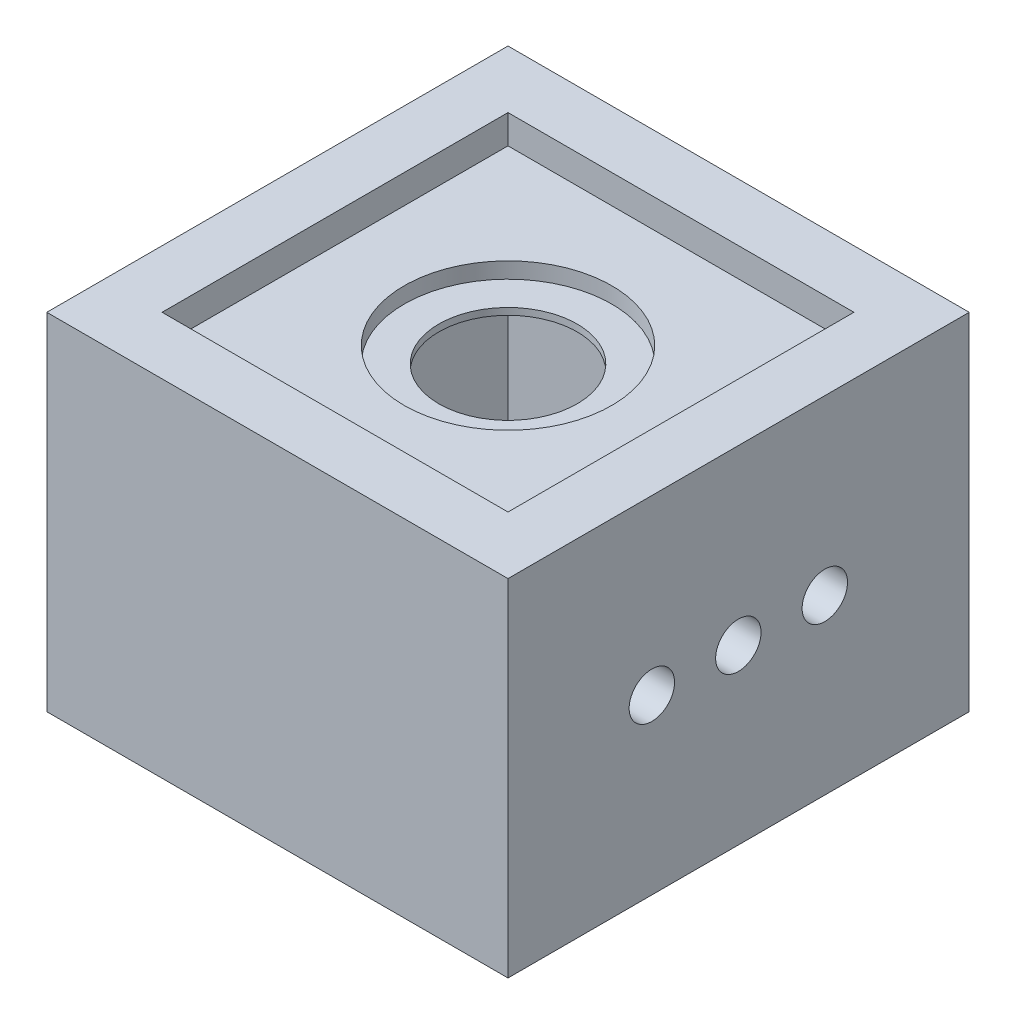
ISO-10303-21;
HEADER;
FILE_DESCRIPTION(('STEP AP214'),'2;1');
FILE_NAME('part.step','',(''),(''),'','','');
FILE_SCHEMA(('AUTOMOTIVE_DESIGN { 1 0 10303 214 1 1 1 1 }'));
ENDSEC;
DATA;
#1=APPLICATION_CONTEXT('core data for automotive mechanical design processes');
#2=APPLICATION_PROTOCOL_DEFINITION('international standard','automotive_design',2000,#1);
#3=PRODUCT_CONTEXT('',#1,'mechanical');
#4=PRODUCT('Part','Part','',(#3));
#5=PRODUCT_RELATED_PRODUCT_CATEGORY('part','',(#4));
#6=PRODUCT_DEFINITION_FORMATION('','',#4);
#7=PRODUCT_DEFINITION_CONTEXT('part definition',#1,'design');
#8=PRODUCT_DEFINITION('design','',#6,#7);
#9=PRODUCT_DEFINITION_SHAPE('','',#8);
#10=(LENGTH_UNIT() NAMED_UNIT(*) SI_UNIT(.MILLI.,.METRE.));
#11=(NAMED_UNIT(*) PLANE_ANGLE_UNIT() SI_UNIT($,.RADIAN.));
#12=(NAMED_UNIT(*) SI_UNIT($,.STERADIAN.) SOLID_ANGLE_UNIT());
#13=UNCERTAINTY_MEASURE_WITH_UNIT(LENGTH_MEASURE(1.E-05),#10,'distance_accuracy_value','');
#14=(GEOMETRIC_REPRESENTATION_CONTEXT(3) GLOBAL_UNCERTAINTY_ASSIGNED_CONTEXT((#13)) GLOBAL_UNIT_ASSIGNED_CONTEXT((#10,
#11,#12)) REPRESENTATION_CONTEXT('',''));
#15=CARTESIAN_POINT('',(0.,0.,0.));
#16=DIRECTION('',(0.,0.,1.));
#17=DIRECTION('',(1.,0.,0.));
#18=AXIS2_PLACEMENT_3D('',#15,#16,#17);
#19=CARTESIAN_POINT('',(0.,64.85,0.));
#20=DIRECTION('',(0.,1.,0.));
#21=DIRECTION('',(0.,0.,1.));
#22=AXIS2_PLACEMENT_3D('',#19,#20,#21);
#23=CYLINDRICAL_SURFACE('',#22,15.24);
#24=CARTESIAN_POINT('',(0.,64.85,0.));
#25=DIRECTION('',(0.,1.,0.));
#26=DIRECTION('',(0.,0.,1.));
#27=AXIS2_PLACEMENT_3D('',#24,#25,#26);
#28=CIRCLE('',#27,15.24);
#29=CARTESIAN_POINT('',(0.,64.85,15.24));
#30=VERTEX_POINT('',#29);
#31=EDGE_CURVE('E153',#30,#30,#28,.T.);
#32=ORIENTED_EDGE('',*,*,#31,.F.);
#33=EDGE_LOOP('',(#32));
#34=FACE_BOUND('',#33,.T.);
#35=CARTESIAN_POINT('',(0.,66.35,0.));
#36=DIRECTION('',(0.,1.,0.));
#37=DIRECTION('',(0.,0.,1.));
#38=AXIS2_PLACEMENT_3D('',#35,#36,#37);
#39=CIRCLE('',#38,15.24);
#40=CARTESIAN_POINT('',(0.,66.35,15.24));
#41=VERTEX_POINT('',#40);
#42=EDGE_CURVE('E37',#41,#41,#39,.F.);
#43=ORIENTED_EDGE('',*,*,#42,.F.);
#44=EDGE_LOOP('',(#43));
#45=FACE_BOUND('',#44,.T.);
#46=ADVANCED_FACE('F33',(#34,#45),#23,.F.);
#47=CARTESIAN_POINT('',(38.1,76.2,38.1));
#48=DIRECTION('',(-1.,0.,0.));
#49=DIRECTION('',(0.,0.,1.));
#50=AXIS2_PLACEMENT_3D('',#47,#48,#49);
#51=PLANE('',#50);
#52=DIRECTION('',(0.,-1.,0.));
#53=VECTOR('',#52,1.);
#54=CARTESIAN_POINT('',(38.1,76.2,-38.1));
#55=LINE('',#54,#53);
#56=CARTESIAN_POINT('',(38.1,76.2,-38.1));
#57=VERTEX_POINT('',#56);
#58=CARTESIAN_POINT('',(38.1,69.85,-38.1));
#59=VERTEX_POINT('',#58);
#60=EDGE_CURVE('E181',#57,#59,#55,.T.);
#61=ORIENTED_EDGE('',*,*,#60,.T.);
#62=DIRECTION('',(0.,0.,-1.));
#63=VECTOR('',#62,1.);
#64=CARTESIAN_POINT('',(38.1,69.85,38.1));
#65=LINE('',#64,#63);
#66=CARTESIAN_POINT('',(38.1,69.85,38.1));
#67=VERTEX_POINT('',#66);
#68=EDGE_CURVE('E150',#67,#59,#65,.T.);
#69=ORIENTED_EDGE('',*,*,#68,.F.);
#70=DIRECTION('',(0.,-1.,0.));
#71=VECTOR('',#70,1.);
#72=CARTESIAN_POINT('',(38.1,76.2,38.1));
#73=LINE('',#72,#71);
#74=CARTESIAN_POINT('',(38.1,76.2,38.1));
#75=VERTEX_POINT('',#74);
#76=EDGE_CURVE('E134',#75,#67,#73,.T.);
#77=ORIENTED_EDGE('',*,*,#76,.F.);
#78=DIRECTION('',(0.,0.,-1.));
#79=VECTOR('',#78,1.);
#80=CARTESIAN_POINT('',(38.1,76.2,38.1));
#81=LINE('',#80,#79);
#82=EDGE_CURVE('E159',#75,#57,#81,.T.);
#83=ORIENTED_EDGE('',*,*,#82,.T.);
#84=EDGE_LOOP('',(#61,#69,#77,#83));
#85=FACE_BOUND('',#84,.T.);
#86=ADVANCED_FACE('F240',(#85),#51,.T.);
#87=CARTESIAN_POINT('',(-38.1,76.2,-38.1));
#88=DIRECTION('',(0.,0.,1.));
#89=DIRECTION('',(1.,0.,0.));
#90=AXIS2_PLACEMENT_3D('',#87,#88,#89);
#91=PLANE('',#90);
#92=DIRECTION('',(0.,-1.,0.));
#93=VECTOR('',#92,1.);
#94=CARTESIAN_POINT('',(-38.1,76.2,-38.1));
#95=LINE('',#94,#93);
#96=CARTESIAN_POINT('',(-38.1,76.2,-38.1));
#97=VERTEX_POINT('',#96);
#98=CARTESIAN_POINT('',(-38.1,69.85,-38.1));
#99=VERTEX_POINT('',#98);
#100=EDGE_CURVE('E177',#97,#99,#95,.T.);
#101=ORIENTED_EDGE('',*,*,#100,.T.);
#102=DIRECTION('',(-1.,0.,0.));
#103=VECTOR('',#102,1.);
#104=CARTESIAN_POINT('',(-38.1,69.85,-38.1));
#105=LINE('',#104,#103);
#106=EDGE_CURVE('E152',#59,#99,#105,.T.);
#107=ORIENTED_EDGE('',*,*,#106,.F.);
#108=ORIENTED_EDGE('',*,*,#60,.F.);
#109=DIRECTION('',(-1.,0.,0.));
#110=VECTOR('',#109,1.);
#111=CARTESIAN_POINT('',(-38.1,76.2,-38.1));
#112=LINE('',#111,#110);
#113=EDGE_CURVE('E161',#57,#97,#112,.T.);
#114=ORIENTED_EDGE('',*,*,#113,.T.);
#115=EDGE_LOOP('',(#101,#107,#108,#114));
#116=FACE_BOUND('',#115,.T.);
#117=ADVANCED_FACE('F246',(#116),#91,.T.);
#118=CARTESIAN_POINT('',(-38.1,76.2,38.1));
#119=DIRECTION('',(1.,0.,0.));
#120=DIRECTION('',(0.,0.,-1.));
#121=AXIS2_PLACEMENT_3D('',#118,#119,#120);
#122=PLANE('',#121);
#123=DIRECTION('',(0.,-1.,0.));
#124=VECTOR('',#123,1.);
#125=CARTESIAN_POINT('',(-38.1,76.2,38.1));
#126=LINE('',#125,#124);
#127=CARTESIAN_POINT('',(-38.1,76.2,38.1));
#128=VERTEX_POINT('',#127);
#129=CARTESIAN_POINT('',(-38.1,69.85,38.1));
#130=VERTEX_POINT('',#129);
#131=EDGE_CURVE('E133',#128,#130,#126,.T.);
#132=ORIENTED_EDGE('',*,*,#131,.T.);
#133=DIRECTION('',(0.,0.,1.));
#134=VECTOR('',#133,1.);
#135=CARTESIAN_POINT('',(-38.1,69.85,38.1));
#136=LINE('',#135,#134);
#137=EDGE_CURVE('E155',#99,#130,#136,.T.);
#138=ORIENTED_EDGE('',*,*,#137,.F.);
#139=ORIENTED_EDGE('',*,*,#100,.F.);
#140=DIRECTION('',(0.,0.,1.));
#141=VECTOR('',#140,1.);
#142=CARTESIAN_POINT('',(-38.1,76.2,38.1));
#143=LINE('',#142,#141);
#144=EDGE_CURVE('E163',#97,#128,#143,.T.);
#145=ORIENTED_EDGE('',*,*,#144,.T.);
#146=EDGE_LOOP('',(#132,#138,#139,#145));
#147=FACE_BOUND('',#146,.T.);
#148=ADVANCED_FACE('F270',(#147),#122,.T.);
#149=CARTESIAN_POINT('',(-38.1,76.2,38.1));
#150=DIRECTION('',(0.,0.,-1.));
#151=DIRECTION('',(-1.,0.,0.));
#152=AXIS2_PLACEMENT_3D('',#149,#150,#151);
#153=PLANE('',#152);
#154=ORIENTED_EDGE('',*,*,#76,.T.);
#155=DIRECTION('',(1.,0.,0.));
#156=VECTOR('',#155,1.);
#157=CARTESIAN_POINT('',(-38.1,69.85,38.1));
#158=LINE('',#157,#156);
#159=EDGE_CURVE('E157',#130,#67,#158,.T.);
#160=ORIENTED_EDGE('',*,*,#159,.F.);
#161=ORIENTED_EDGE('',*,*,#131,.F.);
#162=DIRECTION('',(1.,0.,0.));
#163=VECTOR('',#162,1.);
#164=CARTESIAN_POINT('',(-38.1,76.2,38.1));
#165=LINE('',#164,#163);
#166=EDGE_CURVE('E166',#128,#75,#165,.T.);
#167=ORIENTED_EDGE('',*,*,#166,.T.);
#168=EDGE_LOOP('',(#154,#160,#161,#167));
#169=FACE_BOUND('',#168,.T.);
#170=ADVANCED_FACE('F266',(#169),#153,.T.);
#171=CARTESIAN_POINT('',(0.,76.2,0.));
#172=DIRECTION('',(0.,-1.,0.));
#173=DIRECTION('',(0.,0.,-1.));
#174=AXIS2_PLACEMENT_3D('',#171,#172,#173);
#175=PLANE('',#174);
#176=DIRECTION('',(0.,0.,-1.));
#177=VECTOR('',#176,1.);
#178=CARTESIAN_POINT('',(50.8,76.2,50.8));
#179=LINE('',#178,#177);
#180=CARTESIAN_POINT('',(50.8,76.2,50.8));
#181=VERTEX_POINT('',#180);
#182=CARTESIAN_POINT('',(50.8,76.2,-50.8));
#183=VERTEX_POINT('',#182);
#184=EDGE_CURVE('E185',#181,#183,#179,.T.);
#185=ORIENTED_EDGE('',*,*,#184,.T.);
#186=DIRECTION('',(-1.,0.,0.));
#187=VECTOR('',#186,1.);
#188=CARTESIAN_POINT('',(-50.8,76.2,-50.8));
#189=LINE('',#188,#187);
#190=CARTESIAN_POINT('',(-50.8,76.2,-50.8));
#191=VERTEX_POINT('',#190);
#192=EDGE_CURVE('E188',#183,#191,#189,.T.);
#193=ORIENTED_EDGE('',*,*,#192,.T.);
#194=DIRECTION('',(0.,0.,1.));
#195=VECTOR('',#194,1.);
#196=CARTESIAN_POINT('',(-50.8,76.2,50.8));
#197=LINE('',#196,#195);
#198=CARTESIAN_POINT('',(-50.8,76.2,50.8));
#199=VERTEX_POINT('',#198);
#200=EDGE_CURVE('E191',#191,#199,#197,.T.);
#201=ORIENTED_EDGE('',*,*,#200,.T.);
#202=DIRECTION('',(1.,0.,0.));
#203=VECTOR('',#202,1.);
#204=CARTESIAN_POINT('',(-50.8,76.2,50.8));
#205=LINE('',#204,#203);
#206=EDGE_CURVE('E193',#199,#181,#205,.T.);
#207=ORIENTED_EDGE('',*,*,#206,.T.);
#208=EDGE_LOOP('',(#185,#193,#201,#207));
#209=FACE_BOUND('',#208,.T.);
#210=ORIENTED_EDGE('',*,*,#82,.F.);
#211=ORIENTED_EDGE('',*,*,#166,.F.);
#212=ORIENTED_EDGE('',*,*,#144,.F.);
#213=ORIENTED_EDGE('',*,*,#113,.F.);
#214=EDGE_LOOP('',(#210,#211,#212,#213));
#215=FACE_BOUND('',#214,.T.);
#216=ADVANCED_FACE('F229',(#209,#215),#175,.F.);
#217=CARTESIAN_POINT('',(0.,0.,0.));
#218=DIRECTION('',(0.,-1.,0.));
#219=DIRECTION('',(0.,0.,-1.));
#220=AXIS2_PLACEMENT_3D('',#217,#218,#219);
#221=PLANE('',#220);
#222=DIRECTION('',(0.,0.,-1.));
#223=VECTOR('',#222,1.);
#224=CARTESIAN_POINT('',(50.8,0.,50.8));
#225=LINE('',#224,#223);
#226=CARTESIAN_POINT('',(50.8,0.,50.8));
#227=VERTEX_POINT('',#226);
#228=CARTESIAN_POINT('',(50.8,0.,-50.8));
#229=VERTEX_POINT('',#228);
#230=EDGE_CURVE('E184',#227,#229,#225,.T.);
#231=ORIENTED_EDGE('',*,*,#230,.F.);
#232=DIRECTION('',(1.,0.,0.));
#233=VECTOR('',#232,1.);
#234=CARTESIAN_POINT('',(-50.8,0.,50.8));
#235=LINE('',#234,#233);
#236=CARTESIAN_POINT('',(-50.8,0.,50.8));
#237=VERTEX_POINT('',#236);
#238=EDGE_CURVE('E189',#237,#227,#235,.T.);
#239=ORIENTED_EDGE('',*,*,#238,.F.);
#240=DIRECTION('',(0.,0.,1.));
#241=VECTOR('',#240,1.);
#242=CARTESIAN_POINT('',(-50.8,0.,50.8));
#243=LINE('',#242,#241);
#244=CARTESIAN_POINT('',(-50.8,0.,-50.8));
#245=VERTEX_POINT('',#244);
#246=EDGE_CURVE('E200',#245,#237,#243,.T.);
#247=ORIENTED_EDGE('',*,*,#246,.F.);
#248=DIRECTION('',(-1.,0.,0.));
#249=VECTOR('',#248,1.);
#250=CARTESIAN_POINT('',(-50.8,0.,-50.8));
#251=LINE('',#250,#249);
#252=EDGE_CURVE('E198',#229,#245,#251,.T.);
#253=ORIENTED_EDGE('',*,*,#252,.F.);
#254=EDGE_LOOP('',(#231,#239,#247,#253));
#255=FACE_BOUND('',#254,.T.);
#256=DIRECTION('',(1.,0.,0.));
#257=VECTOR('',#256,1.);
#258=CARTESIAN_POINT('',(-38.1,0.,38.1));
#259=LINE('',#258,#257);
#260=CARTESIAN_POINT('',(-38.1,0.,38.1));
#261=VERTEX_POINT('',#260);
#262=CARTESIAN_POINT('',(38.1,0.,38.1));
#263=VERTEX_POINT('',#262);
#264=EDGE_CURVE('E129',#261,#263,#259,.T.);
#265=ORIENTED_EDGE('',*,*,#264,.T.);
#266=DIRECTION('',(0.,0.,-1.));
#267=VECTOR('',#266,1.);
#268=CARTESIAN_POINT('',(38.1,0.,38.1));
#269=LINE('',#268,#267);
#270=CARTESIAN_POINT('',(38.1,0.,-38.1));
#271=VERTEX_POINT('',#270);
#272=EDGE_CURVE('E143',#263,#271,#269,.T.);
#273=ORIENTED_EDGE('',*,*,#272,.T.);
#274=DIRECTION('',(-1.,0.,0.));
#275=VECTOR('',#274,1.);
#276=CARTESIAN_POINT('',(-38.1,0.,-38.1));
#277=LINE('',#276,#275);
#278=CARTESIAN_POINT('',(-38.1,0.,-38.1));
#279=VERTEX_POINT('',#278);
#280=EDGE_CURVE('E146',#271,#279,#277,.T.);
#281=ORIENTED_EDGE('',*,*,#280,.T.);
#282=DIRECTION('',(0.,0.,1.));
#283=VECTOR('',#282,1.);
#284=CARTESIAN_POINT('',(-38.1,0.,38.1));
#285=LINE('',#284,#283);
#286=EDGE_CURVE('E171',#279,#261,#285,.T.);
#287=ORIENTED_EDGE('',*,*,#286,.T.);
#288=EDGE_LOOP('',(#265,#273,#281,#287));
#289=FACE_BOUND('',#288,.T.);
#290=ADVANCED_FACE('F219',(#255,#289),#221,.T.);
#291=CARTESIAN_POINT('',(50.8,76.2,50.8));
#292=DIRECTION('',(-1.,0.,0.));
#293=DIRECTION('',(0.,0.,1.));
#294=AXIS2_PLACEMENT_3D('',#291,#292,#293);
#295=PLANE('',#294);
#296=CARTESIAN_POINT('',(50.8,38.1,19.1106830094893));
#297=DIRECTION('',(1.,0.,0.));
#298=DIRECTION('',(0.,0.,-1.));
#299=AXIS2_PLACEMENT_3D('',#296,#297,#298);
#300=CIRCLE('',#299,5.);
#301=CARTESIAN_POINT('',(50.8,38.1,14.1106830094893));
#302=VERTEX_POINT('',#301);
#303=EDGE_CURVE('E445',#302,#302,#300,.T.);
#304=ORIENTED_EDGE('',*,*,#303,.F.);
#305=EDGE_LOOP('',(#304));
#306=FACE_BOUND('',#305,.T.);
#307=CARTESIAN_POINT('',(50.8,38.1,0.0606830094893179));
#308=DIRECTION('',(1.,0.,0.));
#309=DIRECTION('',(0.,0.,-1.));
#310=AXIS2_PLACEMENT_3D('',#307,#308,#309);
#311=CIRCLE('',#310,5.);
#312=CARTESIAN_POINT('',(50.8,38.1,-4.93931699051068));
#313=VERTEX_POINT('',#312);
#314=EDGE_CURVE('E457',#313,#313,#311,.T.);
#315=ORIENTED_EDGE('',*,*,#314,.F.);
#316=EDGE_LOOP('',(#315));
#317=FACE_BOUND('',#316,.T.);
#318=CARTESIAN_POINT('',(50.8,38.1,-18.9893169905107));
#319=DIRECTION('',(1.,0.,0.));
#320=DIRECTION('',(0.,0.,-1.));
#321=AXIS2_PLACEMENT_3D('',#318,#319,#320);
#322=CIRCLE('',#321,5.);
#323=CARTESIAN_POINT('',(50.8,38.1,-23.9893169905107));
#324=VERTEX_POINT('',#323);
#325=EDGE_CURVE('E463',#324,#324,#322,.T.);
#326=ORIENTED_EDGE('',*,*,#325,.F.);
#327=EDGE_LOOP('',(#326));
#328=FACE_BOUND('',#327,.T.);
#329=ORIENTED_EDGE('',*,*,#230,.T.);
#330=DIRECTION('',(0.,-1.,0.));
#331=VECTOR('',#330,1.);
#332=CARTESIAN_POINT('',(50.8,76.2,-50.8));
#333=LINE('',#332,#331);
#334=EDGE_CURVE('E11',#183,#229,#333,.T.);
#335=ORIENTED_EDGE('',*,*,#334,.F.);
#336=ORIENTED_EDGE('',*,*,#184,.F.);
#337=DIRECTION('',(0.,-1.,0.));
#338=VECTOR('',#337,1.);
#339=CARTESIAN_POINT('',(50.8,76.2,50.8));
#340=LINE('',#339,#338);
#341=EDGE_CURVE('E195',#181,#227,#340,.T.);
#342=ORIENTED_EDGE('',*,*,#341,.T.);
#343=EDGE_LOOP('',(#329,#335,#336,#342));
#344=FACE_BOUND('',#343,.T.);
#345=ADVANCED_FACE('F35',(#306,#317,#328,#344),#295,.F.);
#346=CARTESIAN_POINT('',(-50.8,76.2,-50.8));
#347=DIRECTION('',(0.,0.,1.));
#348=DIRECTION('',(1.,0.,0.));
#349=AXIS2_PLACEMENT_3D('',#346,#347,#348);
#350=PLANE('',#349);
#351=ORIENTED_EDGE('',*,*,#252,.T.);
#352=DIRECTION('',(0.,-1.,0.));
#353=VECTOR('',#352,1.);
#354=CARTESIAN_POINT('',(-50.8,76.2,-50.8));
#355=LINE('',#354,#353);
#356=EDGE_CURVE('E42',#191,#245,#355,.T.);
#357=ORIENTED_EDGE('',*,*,#356,.F.);
#358=ORIENTED_EDGE('',*,*,#192,.F.);
#359=ORIENTED_EDGE('',*,*,#334,.T.);
#360=EDGE_LOOP('',(#351,#357,#358,#359));
#361=FACE_BOUND('',#360,.T.);
#362=ADVANCED_FACE('F231',(#361),#350,.F.);
#363=CARTESIAN_POINT('',(-50.8,76.2,50.8));
#364=DIRECTION('',(1.,0.,0.));
#365=DIRECTION('',(0.,0.,-1.));
#366=AXIS2_PLACEMENT_3D('',#363,#364,#365);
#367=PLANE('',#366);
#368=ORIENTED_EDGE('',*,*,#246,.T.);
#369=DIRECTION('',(0.,-1.,0.));
#370=VECTOR('',#369,1.);
#371=CARTESIAN_POINT('',(-50.8,76.2,50.8));
#372=LINE('',#371,#370);
#373=EDGE_CURVE('E205',#199,#237,#372,.T.);
#374=ORIENTED_EDGE('',*,*,#373,.F.);
#375=ORIENTED_EDGE('',*,*,#200,.F.);
#376=ORIENTED_EDGE('',*,*,#356,.T.);
#377=EDGE_LOOP('',(#368,#374,#375,#376));
#378=FACE_BOUND('',#377,.T.);
#379=ADVANCED_FACE('F213',(#378),#367,.F.);
#380=CARTESIAN_POINT('',(-50.8,76.2,50.8));
#381=DIRECTION('',(0.,0.,-1.));
#382=DIRECTION('',(-1.,0.,0.));
#383=AXIS2_PLACEMENT_3D('',#380,#381,#382);
#384=PLANE('',#383);
#385=ORIENTED_EDGE('',*,*,#238,.T.);
#386=ORIENTED_EDGE('',*,*,#341,.F.);
#387=ORIENTED_EDGE('',*,*,#206,.F.);
#388=ORIENTED_EDGE('',*,*,#373,.T.);
#389=EDGE_LOOP('',(#385,#386,#387,#388));
#390=FACE_BOUND('',#389,.T.);
#391=ADVANCED_FACE('F223',(#390),#384,.F.);
#392=CARTESIAN_POINT('',(38.1,38.1,19.1106830094893));
#393=DIRECTION('',(-1.,0.,0.));
#394=DIRECTION('',(0.,0.,1.));
#395=AXIS2_PLACEMENT_3D('',#392,#393,#394);
#396=CIRCLE('',#395,5.);
#397=CARTESIAN_POINT('',(38.1,38.1,14.1106830094893));
#398=VERTEX_POINT('',#397);
#399=EDGE_CURVE('E448',#398,#398,#396,.F.);
#400=ORIENTED_EDGE('',*,*,#399,.T.);
#401=EDGE_LOOP('',(#400));
#402=FACE_BOUND('',#401,.T.);
#403=CARTESIAN_POINT('',(38.1,38.1,0.0606830094893179));
#404=DIRECTION('',(-1.,0.,0.));
#405=DIRECTION('',(0.,0.,1.));
#406=AXIS2_PLACEMENT_3D('',#403,#404,#405);
#407=CIRCLE('',#406,5.);
#408=CARTESIAN_POINT('',(38.1,38.1,-4.93931699051068));
#409=VERTEX_POINT('',#408);
#410=EDGE_CURVE('E454',#409,#409,#407,.F.);
#411=ORIENTED_EDGE('',*,*,#410,.T.);
#412=EDGE_LOOP('',(#411));
#413=FACE_BOUND('',#412,.T.);
#414=CARTESIAN_POINT('',(38.1,38.1,-18.9893169905107));
#415=DIRECTION('',(-1.,0.,0.));
#416=DIRECTION('',(0.,0.,1.));
#417=AXIS2_PLACEMENT_3D('',#414,#415,#416);
#418=CIRCLE('',#417,5.);
#419=CARTESIAN_POINT('',(38.1,38.1,-23.9893169905107));
#420=VERTEX_POINT('',#419);
#421=EDGE_CURVE('E460',#420,#420,#418,.F.);
#422=ORIENTED_EDGE('',*,*,#421,.T.);
#423=EDGE_LOOP('',(#422));
#424=FACE_BOUND('',#423,.T.);
#425=DIRECTION('',(0.,0.,-1.));
#426=VECTOR('',#425,1.);
#427=CARTESIAN_POINT('',(38.1,64.85,38.1));
#428=LINE('',#427,#426);
#429=CARTESIAN_POINT('',(38.1,64.85,38.1));
#430=VERTEX_POINT('',#429);
#431=CARTESIAN_POINT('',(38.1,64.85,-38.1));
#432=VERTEX_POINT('',#431);
#433=EDGE_CURVE('E49',#430,#432,#428,.T.);
#434=ORIENTED_EDGE('',*,*,#433,.T.);
#435=EDGE_CURVE('E180',#432,#271,#55,.T.);
#436=ORIENTED_EDGE('',*,*,#435,.T.);
#437=ORIENTED_EDGE('',*,*,#272,.F.);
#438=EDGE_CURVE('E167',#430,#263,#73,.T.);
#439=ORIENTED_EDGE('',*,*,#438,.F.);
#440=EDGE_LOOP('',(#434,#436,#437,#439));
#441=FACE_BOUND('',#440,.T.);
#442=ADVANCED_FACE('F249',(#402,#413,#424,#441),#51,.T.);
#443=DIRECTION('',(-1.,0.,0.));
#444=VECTOR('',#443,1.);
#445=CARTESIAN_POINT('',(-38.1,64.85,-38.1));
#446=LINE('',#445,#444);
#447=CARTESIAN_POINT('',(-38.1,64.85,-38.1));
#448=VERTEX_POINT('',#447);
#449=EDGE_CURVE('E56',#432,#448,#446,.T.);
#450=ORIENTED_EDGE('',*,*,#449,.T.);
#451=EDGE_CURVE('E139',#448,#279,#95,.T.);
#452=ORIENTED_EDGE('',*,*,#451,.T.);
#453=ORIENTED_EDGE('',*,*,#280,.F.);
#454=ORIENTED_EDGE('',*,*,#435,.F.);
#455=EDGE_LOOP('',(#450,#452,#453,#454));
#456=FACE_BOUND('',#455,.T.);
#457=ADVANCED_FACE('F269',(#456),#91,.T.);
#458=DIRECTION('',(0.,0.,1.));
#459=VECTOR('',#458,1.);
#460=CARTESIAN_POINT('',(-38.1,64.85,38.1));
#461=LINE('',#460,#459);
#462=CARTESIAN_POINT('',(-38.1,64.85,38.1));
#463=VERTEX_POINT('',#462);
#464=EDGE_CURVE('E137',#448,#463,#461,.T.);
#465=ORIENTED_EDGE('',*,*,#464,.T.);
#466=EDGE_CURVE('E123',#463,#261,#126,.T.);
#467=ORIENTED_EDGE('',*,*,#466,.T.);
#468=ORIENTED_EDGE('',*,*,#286,.F.);
#469=ORIENTED_EDGE('',*,*,#451,.F.);
#470=EDGE_LOOP('',(#465,#467,#468,#469));
#471=FACE_BOUND('',#470,.T.);
#472=ADVANCED_FACE('F138',(#471),#122,.T.);
#473=DIRECTION('',(1.,0.,0.));
#474=VECTOR('',#473,1.);
#475=CARTESIAN_POINT('',(-38.1,64.85,38.1));
#476=LINE('',#475,#474);
#477=EDGE_CURVE('E127',#463,#430,#476,.T.);
#478=ORIENTED_EDGE('',*,*,#477,.T.);
#479=ORIENTED_EDGE('',*,*,#438,.T.);
#480=ORIENTED_EDGE('',*,*,#264,.F.);
#481=ORIENTED_EDGE('',*,*,#466,.F.);
#482=EDGE_LOOP('',(#478,#479,#480,#481));
#483=FACE_BOUND('',#482,.T.);
#484=ADVANCED_FACE('F125',(#483),#153,.T.);
#485=CARTESIAN_POINT('',(0.,64.85,0.));
#486=DIRECTION('',(0.,-1.,0.));
#487=DIRECTION('',(0.,0.,-1.));
#488=AXIS2_PLACEMENT_3D('',#485,#486,#487);
#489=PLANE('',#488);
#490=ORIENTED_EDGE('',*,*,#31,.T.);
#491=EDGE_LOOP('',(#490));
#492=FACE_BOUND('',#491,.T.);
#493=ORIENTED_EDGE('',*,*,#433,.F.);
#494=ORIENTED_EDGE('',*,*,#477,.F.);
#495=ORIENTED_EDGE('',*,*,#464,.F.);
#496=ORIENTED_EDGE('',*,*,#449,.F.);
#497=EDGE_LOOP('',(#493,#494,#495,#496));
#498=FACE_BOUND('',#497,.T.);
#499=ADVANCED_FACE('F142',(#492,#498),#489,.T.);
#500=CARTESIAN_POINT('',(0.,69.85,0.));
#501=DIRECTION('',(0.,-1.,0.));
#502=DIRECTION('',(0.,0.,-1.));
#503=AXIS2_PLACEMENT_3D('',#500,#501,#502);
#504=PLANE('',#503);
#505=CARTESIAN_POINT('',(0.,69.85,0.));
#506=DIRECTION('',(0.,1.,0.));
#507=DIRECTION('',(0.,0.,1.));
#508=AXIS2_PLACEMENT_3D('',#505,#506,#507);
#509=CIRCLE('',#508,22.86);
#510=CARTESIAN_POINT('',(0.,69.85,22.86));
#511=VERTEX_POINT('',#510);
#512=EDGE_CURVE('E449',#511,#511,#509,.T.);
#513=ORIENTED_EDGE('',*,*,#512,.F.);
#514=EDGE_LOOP('',(#513));
#515=FACE_BOUND('',#514,.T.);
#516=ORIENTED_EDGE('',*,*,#68,.T.);
#517=ORIENTED_EDGE('',*,*,#106,.T.);
#518=ORIENTED_EDGE('',*,*,#137,.T.);
#519=ORIENTED_EDGE('',*,*,#159,.T.);
#520=EDGE_LOOP('',(#516,#517,#518,#519));
#521=FACE_BOUND('',#520,.T.);
#522=ADVANCED_FACE('F258',(#515,#521),#504,.F.);
#523=CARTESIAN_POINT('',(0.,66.35,0.));
#524=DIRECTION('',(0.,1.,0.));
#525=DIRECTION('',(0.,0.,1.));
#526=AXIS2_PLACEMENT_3D('',#523,#524,#525);
#527=PLANE('',#526);
#528=CARTESIAN_POINT('',(0.,66.35,0.));
#529=DIRECTION('',(0.,1.,0.));
#530=DIRECTION('',(0.,0.,1.));
#531=AXIS2_PLACEMENT_3D('',#528,#529,#530);
#532=CIRCLE('',#531,22.86);
#533=CARTESIAN_POINT('',(0.,66.35,22.86));
#534=VERTEX_POINT('',#533);
#535=EDGE_CURVE('E452',#534,#534,#532,.T.);
#536=ORIENTED_EDGE('',*,*,#535,.T.);
#537=EDGE_LOOP('',(#536));
#538=FACE_BOUND('',#537,.T.);
#539=ORIENTED_EDGE('',*,*,#42,.T.);
#540=EDGE_LOOP('',(#539));
#541=FACE_BOUND('',#540,.T.);
#542=ADVANCED_FACE('F262',(#538,#541),#527,.T.);
#543=CARTESIAN_POINT('',(0.,66.35,0.));
#544=DIRECTION('',(0.,1.,0.));
#545=DIRECTION('',(0.,0.,1.));
#546=AXIS2_PLACEMENT_3D('',#543,#544,#545);
#547=CYLINDRICAL_SURFACE('',#546,22.86);
#548=CARTESIAN_POINT('',(0.,66.35,22.86));
#549=CARTESIAN_POINT('',(0.,66.3864583333333,22.86));
#550=CARTESIAN_POINT('',(0.,66.4229166666667,22.86));
#551=CARTESIAN_POINT('',(0.,66.4958333333333,22.86));
#552=CARTESIAN_POINT('',(0.,66.5322916666667,22.86));
#553=CARTESIAN_POINT('',(0.,66.6052083333333,22.86));
#554=CARTESIAN_POINT('',(0.,66.6416666666667,22.86));
#555=CARTESIAN_POINT('',(0.,66.7145833333333,22.86));
#556=CARTESIAN_POINT('',(0.,66.7510416666667,22.86));
#557=CARTESIAN_POINT('',(0.,66.8239583333333,22.86));
#558=CARTESIAN_POINT('',(0.,66.8604166666667,22.86));
#559=CARTESIAN_POINT('',(0.,66.9333333333333,22.86));
#560=CARTESIAN_POINT('',(0.,66.9697916666667,22.86));
#561=CARTESIAN_POINT('',(0.,67.0427083333333,22.86));
#562=CARTESIAN_POINT('',(0.,67.0791666666667,22.86));
#563=CARTESIAN_POINT('',(0.,67.1520833333333,22.86));
#564=CARTESIAN_POINT('',(0.,67.1885416666667,22.86));
#565=CARTESIAN_POINT('',(0.,67.2614583333333,22.86));
#566=CARTESIAN_POINT('',(0.,67.2979166666667,22.86));
#567=CARTESIAN_POINT('',(0.,67.3708333333333,22.86));
#568=CARTESIAN_POINT('',(0.,67.4072916666667,22.86));
#569=CARTESIAN_POINT('',(0.,67.4802083333333,22.86));
#570=CARTESIAN_POINT('',(0.,67.5166666666667,22.86));
#571=CARTESIAN_POINT('',(0.,67.5895833333333,22.86));
#572=CARTESIAN_POINT('',(0.,67.6260416666667,22.86));
#573=CARTESIAN_POINT('',(0.,67.6989583333333,22.86));
#574=CARTESIAN_POINT('',(0.,67.7354166666667,22.86));
#575=CARTESIAN_POINT('',(0.,67.8083333333333,22.86));
#576=CARTESIAN_POINT('',(0.,67.8447916666667,22.86));
#577=CARTESIAN_POINT('',(0.,67.9177083333333,22.86));
#578=CARTESIAN_POINT('',(0.,67.9541666666667,22.86));
#579=CARTESIAN_POINT('',(0.,68.0270833333333,22.86));
#580=CARTESIAN_POINT('',(0.,68.0635416666667,22.86));
#581=CARTESIAN_POINT('',(0.,68.1364583333333,22.86));
#582=CARTESIAN_POINT('',(0.,68.1729166666667,22.86));
#583=CARTESIAN_POINT('',(0.,68.2458333333333,22.86));
#584=CARTESIAN_POINT('',(0.,68.2822916666667,22.86));
#585=CARTESIAN_POINT('',(0.,68.3552083333333,22.86));
#586=CARTESIAN_POINT('',(0.,68.3916666666667,22.86));
#587=CARTESIAN_POINT('',(0.,68.4645833333333,22.86));
#588=CARTESIAN_POINT('',(0.,68.5010416666667,22.86));
#589=CARTESIAN_POINT('',(0.,68.5739583333333,22.86));
#590=CARTESIAN_POINT('',(0.,68.6104166666667,22.86));
#591=CARTESIAN_POINT('',(0.,68.6833333333333,22.86));
#592=CARTESIAN_POINT('',(0.,68.7197916666667,22.86));
#593=CARTESIAN_POINT('',(0.,68.7927083333333,22.86));
#594=CARTESIAN_POINT('',(0.,68.8291666666667,22.86));
#595=CARTESIAN_POINT('',(0.,68.9020833333333,22.86));
#596=CARTESIAN_POINT('',(0.,68.9385416666667,22.86));
#597=CARTESIAN_POINT('',(0.,69.0114583333334,22.86));
#598=CARTESIAN_POINT('',(0.,69.0479166666667,22.86));
#599=CARTESIAN_POINT('',(0.,69.1208333333333,22.86));
#600=CARTESIAN_POINT('',(0.,69.1572916666667,22.86));
#601=CARTESIAN_POINT('',(0.,69.2302083333333,22.86));
#602=CARTESIAN_POINT('',(0.,69.2666666666667,22.86));
#603=CARTESIAN_POINT('',(0.,69.3395833333333,22.86));
#604=CARTESIAN_POINT('',(0.,69.3760416666667,22.86));
#605=CARTESIAN_POINT('',(0.,69.4489583333333,22.86));
#606=CARTESIAN_POINT('',(0.,69.4854166666667,22.86));
#607=CARTESIAN_POINT('',(0.,69.5583333333333,22.86));
#608=CARTESIAN_POINT('',(0.,69.5947916666667,22.86));
#609=CARTESIAN_POINT('',(0.,69.6677083333333,22.86));
#610=CARTESIAN_POINT('',(0.,69.7041666666667,22.86));
#611=CARTESIAN_POINT('',(0.,69.7770833333333,22.86));
#612=CARTESIAN_POINT('',(0.,69.8135416666667,22.86));
#613=CARTESIAN_POINT('',(0.,69.85,22.86));
#614=B_SPLINE_CURVE_WITH_KNOTS('',3,(#548,#549,#550,#551,#552,#553,#554,#555,#556,#557,#558,
#559,#560,#561,#562,#563,#564,#565,#566,#567,#568,#569,#570,#571,#572,#573,#574,#575,#576,#577,
#578,#579,#580,#581,#582,#583,#584,#585,#586,#587,#588,#589,#590,#591,#592,#593,#594,#595,#596,
#597,#598,#599,#600,#601,#602,#603,#604,#605,#606,#607,#608,#609,#610,#611,#612,#613),
.UNSPECIFIED.,.F.,.F.,(4,2,2,2,2,2,2,2,2,2,2,2,2,2,2,2,2,2,2,2,2,2,2,2,2,2,2,2,2,2,2,2,4),(0.,
0.109375000000009,0.218750000000004,0.328125000000012,0.437500000000007,0.546875000000002,
0.656250000000011,0.765625000000006,0.875000000000015,0.98437500000001,1.09375,1.20312500000001,
1.31250000000001,1.421875,1.53125000000001,1.64062500000001,1.75000000000002,1.85937500000001,
1.96875000000001,2.07812500000001,2.18750000000001,2.296875,2.40625000000001,2.51562500000001,
2.62500000000002,2.73437500000001,2.84375000000001,2.95312500000001,3.06250000000001,3.171875,
3.28125000000001,3.39062500000001,3.50000000000002),.UNSPECIFIED.);
#615=EDGE_CURVE('BSEAM254',#534,#511,#614,.T.);
#616=ORIENTED_EDGE('',*,*,#535,.F.);
#617=ORIENTED_EDGE('',*,*,#512,.T.);
#618=ORIENTED_EDGE('',*,*,#615,.T.);
#619=ORIENTED_EDGE('',*,*,#615,.F.);
#620=EDGE_LOOP('',(#616,#618,#617,#619));
#621=FACE_BOUND('',#620,.T.);
#622=ADVANCED_FACE('F254',(#621),#547,.F.);
#623=CARTESIAN_POINT('',(23.957864376269,38.1,-18.9893169905107));
#624=DIRECTION('',(1.,0.,0.));
#625=DIRECTION('',(0.,0.,-1.));
#626=AXIS2_PLACEMENT_3D('',#623,#624,#625);
#627=CYLINDRICAL_SURFACE('',#626,5.);
#628=CARTESIAN_POINT('',(50.8,38.1,-23.9893169905107));
#629=CARTESIAN_POINT('',(50.6677083333333,38.1,-23.9893169905107));
#630=CARTESIAN_POINT('',(50.5354166666667,38.1,-23.9893169905107));
#631=CARTESIAN_POINT('',(50.2708333333333,38.1,-23.9893169905107));
#632=CARTESIAN_POINT('',(50.1385416666667,38.1,-23.9893169905107));
#633=CARTESIAN_POINT('',(49.8739583333333,38.1,-23.9893169905107));
#634=CARTESIAN_POINT('',(49.7416666666667,38.1,-23.9893169905107));
#635=CARTESIAN_POINT('',(49.4770833333333,38.1,-23.9893169905107));
#636=CARTESIAN_POINT('',(49.3447916666667,38.1,-23.9893169905107));
#637=CARTESIAN_POINT('',(49.0802083333333,38.1,-23.9893169905107));
#638=CARTESIAN_POINT('',(48.9479166666667,38.1,-23.9893169905107));
#639=CARTESIAN_POINT('',(48.6833333333333,38.1,-23.9893169905107));
#640=CARTESIAN_POINT('',(48.5510416666667,38.1,-23.9893169905107));
#641=CARTESIAN_POINT('',(48.2864583333333,38.1,-23.9893169905107));
#642=CARTESIAN_POINT('',(48.1541666666667,38.1,-23.9893169905107));
#643=CARTESIAN_POINT('',(47.8895833333333,38.1,-23.9893169905107));
#644=CARTESIAN_POINT('',(47.7572916666667,38.1,-23.9893169905107));
#645=CARTESIAN_POINT('',(47.4927083333333,38.1,-23.9893169905107));
#646=CARTESIAN_POINT('',(47.3604166666667,38.1,-23.9893169905107));
#647=CARTESIAN_POINT('',(47.0958333333333,38.1,-23.9893169905107));
#648=CARTESIAN_POINT('',(46.9635416666667,38.1,-23.9893169905107));
#649=CARTESIAN_POINT('',(46.6989583333333,38.1,-23.9893169905107));
#650=CARTESIAN_POINT('',(46.5666666666667,38.1,-23.9893169905107));
#651=CARTESIAN_POINT('',(46.3020833333333,38.1,-23.9893169905107));
#652=CARTESIAN_POINT('',(46.1697916666667,38.1,-23.9893169905107));
#653=CARTESIAN_POINT('',(45.9052083333333,38.1,-23.9893169905107));
#654=CARTESIAN_POINT('',(45.7729166666667,38.1,-23.9893169905107));
#655=CARTESIAN_POINT('',(45.5083333333333,38.1,-23.9893169905107));
#656=CARTESIAN_POINT('',(45.3760416666667,38.1,-23.9893169905107));
#657=CARTESIAN_POINT('',(45.1114583333333,38.1,-23.9893169905107));
#658=CARTESIAN_POINT('',(44.9791666666667,38.1,-23.9893169905107));
#659=CARTESIAN_POINT('',(44.7145833333333,38.1,-23.9893169905107));
#660=CARTESIAN_POINT('',(44.5822916666667,38.1,-23.9893169905107));
#661=CARTESIAN_POINT('',(44.3177083333333,38.1,-23.9893169905107));
#662=CARTESIAN_POINT('',(44.1854166666667,38.1,-23.9893169905107));
#663=CARTESIAN_POINT('',(43.9208333333333,38.1,-23.9893169905107));
#664=CARTESIAN_POINT('',(43.7885416666667,38.1,-23.9893169905107));
#665=CARTESIAN_POINT('',(43.5239583333333,38.1,-23.9893169905107));
#666=CARTESIAN_POINT('',(43.3916666666667,38.1,-23.9893169905107));
#667=CARTESIAN_POINT('',(43.1270833333333,38.1,-23.9893169905107));
#668=CARTESIAN_POINT('',(42.9947916666667,38.1,-23.9893169905107));
#669=CARTESIAN_POINT('',(42.7302083333333,38.1,-23.9893169905107));
#670=CARTESIAN_POINT('',(42.5979166666667,38.1,-23.9893169905107));
#671=CARTESIAN_POINT('',(42.3333333333333,38.1,-23.9893169905107));
#672=CARTESIAN_POINT('',(42.2010416666667,38.1,-23.9893169905107));
#673=CARTESIAN_POINT('',(41.9364583333333,38.1,-23.9893169905107));
#674=CARTESIAN_POINT('',(41.8041666666667,38.1,-23.9893169905107));
#675=CARTESIAN_POINT('',(41.5395833333333,38.1,-23.9893169905107));
#676=CARTESIAN_POINT('',(41.4072916666667,38.1,-23.9893169905107));
#677=CARTESIAN_POINT('',(41.1427083333333,38.1,-23.9893169905107));
#678=CARTESIAN_POINT('',(41.0104166666667,38.1,-23.9893169905107));
#679=CARTESIAN_POINT('',(40.7458333333333,38.1,-23.9893169905107));
#680=CARTESIAN_POINT('',(40.6135416666667,38.1,-23.9893169905107));
#681=CARTESIAN_POINT('',(40.3489583333333,38.1,-23.9893169905107));
#682=CARTESIAN_POINT('',(40.2166666666667,38.1,-23.9893169905107));
#683=CARTESIAN_POINT('',(39.9520833333333,38.1,-23.9893169905107));
#684=CARTESIAN_POINT('',(39.8197916666667,38.1,-23.9893169905107));
#685=CARTESIAN_POINT('',(39.5552083333333,38.1,-23.9893169905107));
#686=CARTESIAN_POINT('',(39.4229166666667,38.1,-23.9893169905107));
#687=CARTESIAN_POINT('',(39.1583333333333,38.1,-23.9893169905107));
#688=CARTESIAN_POINT('',(39.0260416666667,38.1,-23.9893169905107));
#689=CARTESIAN_POINT('',(38.7614583333333,38.1,-23.9893169905107));
#690=CARTESIAN_POINT('',(38.6291666666667,38.1,-23.9893169905107));
#691=CARTESIAN_POINT('',(38.3645833333333,38.1,-23.9893169905107));
#692=CARTESIAN_POINT('',(38.2322916666667,38.1,-23.9893169905107));
#693=CARTESIAN_POINT('',(38.1,38.1,-23.9893169905107));
#694=B_SPLINE_CURVE_WITH_KNOTS('',3,(#628,#629,#630,#631,#632,#633,#634,#635,#636,#637,#638,
#639,#640,#641,#642,#643,#644,#645,#646,#647,#648,#649,#650,#651,#652,#653,#654,#655,#656,#657,
#658,#659,#660,#661,#662,#663,#664,#665,#666,#667,#668,#669,#670,#671,#672,#673,#674,#675,#676,
#677,#678,#679,#680,#681,#682,#683,#684,#685,#686,#687,#688,#689,#690,#691,#692,#693),
.UNSPECIFIED.,.F.,.F.,(4,2,2,2,2,2,2,2,2,2,2,2,2,2,2,2,2,2,2,2,2,2,2,2,2,2,2,2,2,2,2,2,4),(0.,
0.396874999999998,0.793749999999996,1.190625,1.58749999999999,1.984375,2.38125,2.77812499999999,
3.175,3.571875,3.96874999999999,4.365625,4.7625,5.15937499999999,5.55625,5.953125,
6.34999999999999,6.746875,7.14375,7.540625,7.9375,8.334375,8.73125,9.128125,9.525,9.921875,
10.31875,10.715625,11.1125,11.509375,11.90625,12.303125,12.7),.UNSPECIFIED.);
#695=EDGE_CURVE('BSEAM324',#324,#420,#694,.T.);
#696=ORIENTED_EDGE('',*,*,#325,.T.);
#697=ORIENTED_EDGE('',*,*,#421,.F.);
#698=ORIENTED_EDGE('',*,*,#695,.T.);
#699=ORIENTED_EDGE('',*,*,#695,.F.);
#700=EDGE_LOOP('',(#696,#698,#697,#699));
#701=FACE_BOUND('',#700,.T.);
#702=ADVANCED_FACE('F324',(#701),#627,.F.);
#703=CARTESIAN_POINT('',(23.957864376269,38.1,0.0606830094893179));
#704=DIRECTION('',(1.,0.,0.));
#705=DIRECTION('',(0.,0.,-1.));
#706=AXIS2_PLACEMENT_3D('',#703,#704,#705);
#707=CYLINDRICAL_SURFACE('',#706,5.);
#708=CARTESIAN_POINT('',(50.8,38.1,-4.93931699051068));
#709=CARTESIAN_POINT('',(50.6677083333333,38.1,-4.93931699051068));
#710=CARTESIAN_POINT('',(50.5354166666667,38.1,-4.93931699051068));
#711=CARTESIAN_POINT('',(50.2708333333333,38.1,-4.93931699051068));
#712=CARTESIAN_POINT('',(50.1385416666667,38.1,-4.93931699051068));
#713=CARTESIAN_POINT('',(49.8739583333333,38.1,-4.93931699051068));
#714=CARTESIAN_POINT('',(49.7416666666667,38.1,-4.93931699051068));
#715=CARTESIAN_POINT('',(49.4770833333333,38.1,-4.93931699051068));
#716=CARTESIAN_POINT('',(49.3447916666667,38.1,-4.93931699051068));
#717=CARTESIAN_POINT('',(49.0802083333333,38.1,-4.93931699051068));
#718=CARTESIAN_POINT('',(48.9479166666667,38.1,-4.93931699051068));
#719=CARTESIAN_POINT('',(48.6833333333333,38.1,-4.93931699051068));
#720=CARTESIAN_POINT('',(48.5510416666667,38.1,-4.93931699051068));
#721=CARTESIAN_POINT('',(48.2864583333333,38.1,-4.93931699051068));
#722=CARTESIAN_POINT('',(48.1541666666667,38.1,-4.93931699051068));
#723=CARTESIAN_POINT('',(47.8895833333333,38.1,-4.93931699051068));
#724=CARTESIAN_POINT('',(47.7572916666667,38.1,-4.93931699051068));
#725=CARTESIAN_POINT('',(47.4927083333333,38.1,-4.93931699051068));
#726=CARTESIAN_POINT('',(47.3604166666667,38.1,-4.93931699051068));
#727=CARTESIAN_POINT('',(47.0958333333333,38.1,-4.93931699051068));
#728=CARTESIAN_POINT('',(46.9635416666667,38.1,-4.93931699051068));
#729=CARTESIAN_POINT('',(46.6989583333333,38.1,-4.93931699051068));
#730=CARTESIAN_POINT('',(46.5666666666667,38.1,-4.93931699051068));
#731=CARTESIAN_POINT('',(46.3020833333333,38.1,-4.93931699051068));
#732=CARTESIAN_POINT('',(46.1697916666667,38.1,-4.93931699051068));
#733=CARTESIAN_POINT('',(45.9052083333333,38.1,-4.93931699051068));
#734=CARTESIAN_POINT('',(45.7729166666667,38.1,-4.93931699051068));
#735=CARTESIAN_POINT('',(45.5083333333333,38.1,-4.93931699051068));
#736=CARTESIAN_POINT('',(45.3760416666667,38.1,-4.93931699051068));
#737=CARTESIAN_POINT('',(45.1114583333333,38.1,-4.93931699051068));
#738=CARTESIAN_POINT('',(44.9791666666667,38.1,-4.93931699051068));
#739=CARTESIAN_POINT('',(44.7145833333333,38.1,-4.93931699051068));
#740=CARTESIAN_POINT('',(44.5822916666667,38.1,-4.93931699051068));
#741=CARTESIAN_POINT('',(44.3177083333333,38.1,-4.93931699051068));
#742=CARTESIAN_POINT('',(44.1854166666667,38.1,-4.93931699051068));
#743=CARTESIAN_POINT('',(43.9208333333333,38.1,-4.93931699051068));
#744=CARTESIAN_POINT('',(43.7885416666667,38.1,-4.93931699051068));
#745=CARTESIAN_POINT('',(43.5239583333333,38.1,-4.93931699051068));
#746=CARTESIAN_POINT('',(43.3916666666667,38.1,-4.93931699051068));
#747=CARTESIAN_POINT('',(43.1270833333333,38.1,-4.93931699051068));
#748=CARTESIAN_POINT('',(42.9947916666667,38.1,-4.93931699051068));
#749=CARTESIAN_POINT('',(42.7302083333333,38.1,-4.93931699051068));
#750=CARTESIAN_POINT('',(42.5979166666667,38.1,-4.93931699051068));
#751=CARTESIAN_POINT('',(42.3333333333333,38.1,-4.93931699051068));
#752=CARTESIAN_POINT('',(42.2010416666667,38.1,-4.93931699051068));
#753=CARTESIAN_POINT('',(41.9364583333333,38.1,-4.93931699051068));
#754=CARTESIAN_POINT('',(41.8041666666667,38.1,-4.93931699051068));
#755=CARTESIAN_POINT('',(41.5395833333333,38.1,-4.93931699051068));
#756=CARTESIAN_POINT('',(41.4072916666667,38.1,-4.93931699051068));
#757=CARTESIAN_POINT('',(41.1427083333333,38.1,-4.93931699051068));
#758=CARTESIAN_POINT('',(41.0104166666667,38.1,-4.93931699051068));
#759=CARTESIAN_POINT('',(40.7458333333333,38.1,-4.93931699051068));
#760=CARTESIAN_POINT('',(40.6135416666667,38.1,-4.93931699051068));
#761=CARTESIAN_POINT('',(40.3489583333333,38.1,-4.93931699051068));
#762=CARTESIAN_POINT('',(40.2166666666667,38.1,-4.93931699051068));
#763=CARTESIAN_POINT('',(39.9520833333333,38.1,-4.93931699051068));
#764=CARTESIAN_POINT('',(39.8197916666667,38.1,-4.93931699051068));
#765=CARTESIAN_POINT('',(39.5552083333333,38.1,-4.93931699051068));
#766=CARTESIAN_POINT('',(39.4229166666667,38.1,-4.93931699051068));
#767=CARTESIAN_POINT('',(39.1583333333333,38.1,-4.93931699051068));
#768=CARTESIAN_POINT('',(39.0260416666667,38.1,-4.93931699051068));
#769=CARTESIAN_POINT('',(38.7614583333333,38.1,-4.93931699051068));
#770=CARTESIAN_POINT('',(38.6291666666667,38.1,-4.93931699051068));
#771=CARTESIAN_POINT('',(38.3645833333333,38.1,-4.93931699051068));
#772=CARTESIAN_POINT('',(38.2322916666667,38.1,-4.93931699051068));
#773=CARTESIAN_POINT('',(38.1,38.1,-4.93931699051068));
#774=B_SPLINE_CURVE_WITH_KNOTS('',3,(#708,#709,#710,#711,#712,#713,#714,#715,#716,#717,#718,
#719,#720,#721,#722,#723,#724,#725,#726,#727,#728,#729,#730,#731,#732,#733,#734,#735,#736,#737,
#738,#739,#740,#741,#742,#743,#744,#745,#746,#747,#748,#749,#750,#751,#752,#753,#754,#755,#756,
#757,#758,#759,#760,#761,#762,#763,#764,#765,#766,#767,#768,#769,#770,#771,#772,#773),
.UNSPECIFIED.,.F.,.F.,(4,2,2,2,2,2,2,2,2,2,2,2,2,2,2,2,2,2,2,2,2,2,2,2,2,2,2,2,2,2,2,2,4),(0.,
0.396874999999998,0.793749999999996,1.190625,1.58749999999999,1.984375,2.38125,2.77812499999999,
3.175,3.571875,3.96874999999999,4.365625,4.7625,5.15937499999999,5.55625,5.953125,
6.34999999999999,6.746875,7.14375,7.540625,7.9375,8.334375,8.73125,9.128125,9.525,9.921875,
10.31875,10.715625,11.1125,11.509375,11.90625,12.303125,12.7),.UNSPECIFIED.);
#775=EDGE_CURVE('BSEAM330',#313,#409,#774,.T.);
#776=ORIENTED_EDGE('',*,*,#314,.T.);
#777=ORIENTED_EDGE('',*,*,#410,.F.);
#778=ORIENTED_EDGE('',*,*,#775,.T.);
#779=ORIENTED_EDGE('',*,*,#775,.F.);
#780=EDGE_LOOP('',(#776,#778,#777,#779));
#781=FACE_BOUND('',#780,.T.);
#782=ADVANCED_FACE('F330',(#781),#707,.F.);
#783=CARTESIAN_POINT('',(23.957864376269,38.1,19.1106830094893));
#784=DIRECTION('',(1.,0.,0.));
#785=DIRECTION('',(0.,0.,-1.));
#786=AXIS2_PLACEMENT_3D('',#783,#784,#785);
#787=CYLINDRICAL_SURFACE('',#786,5.);
#788=CARTESIAN_POINT('',(50.8,38.1,14.1106830094893));
#789=CARTESIAN_POINT('',(50.6677083333333,38.1,14.1106830094893));
#790=CARTESIAN_POINT('',(50.5354166666667,38.1,14.1106830094893));
#791=CARTESIAN_POINT('',(50.2708333333333,38.1,14.1106830094893));
#792=CARTESIAN_POINT('',(50.1385416666667,38.1,14.1106830094893));
#793=CARTESIAN_POINT('',(49.8739583333333,38.1,14.1106830094893));
#794=CARTESIAN_POINT('',(49.7416666666667,38.1,14.1106830094893));
#795=CARTESIAN_POINT('',(49.4770833333333,38.1,14.1106830094893));
#796=CARTESIAN_POINT('',(49.3447916666667,38.1,14.1106830094893));
#797=CARTESIAN_POINT('',(49.0802083333333,38.1,14.1106830094893));
#798=CARTESIAN_POINT('',(48.9479166666667,38.1,14.1106830094893));
#799=CARTESIAN_POINT('',(48.6833333333333,38.1,14.1106830094893));
#800=CARTESIAN_POINT('',(48.5510416666667,38.1,14.1106830094893));
#801=CARTESIAN_POINT('',(48.2864583333333,38.1,14.1106830094893));
#802=CARTESIAN_POINT('',(48.1541666666667,38.1,14.1106830094893));
#803=CARTESIAN_POINT('',(47.8895833333333,38.1,14.1106830094893));
#804=CARTESIAN_POINT('',(47.7572916666667,38.1,14.1106830094893));
#805=CARTESIAN_POINT('',(47.4927083333333,38.1,14.1106830094893));
#806=CARTESIAN_POINT('',(47.3604166666667,38.1,14.1106830094893));
#807=CARTESIAN_POINT('',(47.0958333333333,38.1,14.1106830094893));
#808=CARTESIAN_POINT('',(46.9635416666667,38.1,14.1106830094893));
#809=CARTESIAN_POINT('',(46.6989583333333,38.1,14.1106830094893));
#810=CARTESIAN_POINT('',(46.5666666666667,38.1,14.1106830094893));
#811=CARTESIAN_POINT('',(46.3020833333333,38.1,14.1106830094893));
#812=CARTESIAN_POINT('',(46.1697916666667,38.1,14.1106830094893));
#813=CARTESIAN_POINT('',(45.9052083333333,38.1,14.1106830094893));
#814=CARTESIAN_POINT('',(45.7729166666667,38.1,14.1106830094893));
#815=CARTESIAN_POINT('',(45.5083333333333,38.1,14.1106830094893));
#816=CARTESIAN_POINT('',(45.3760416666667,38.1,14.1106830094893));
#817=CARTESIAN_POINT('',(45.1114583333333,38.1,14.1106830094893));
#818=CARTESIAN_POINT('',(44.9791666666667,38.1,14.1106830094893));
#819=CARTESIAN_POINT('',(44.7145833333333,38.1,14.1106830094893));
#820=CARTESIAN_POINT('',(44.5822916666667,38.1,14.1106830094893));
#821=CARTESIAN_POINT('',(44.3177083333333,38.1,14.1106830094893));
#822=CARTESIAN_POINT('',(44.1854166666667,38.1,14.1106830094893));
#823=CARTESIAN_POINT('',(43.9208333333333,38.1,14.1106830094893));
#824=CARTESIAN_POINT('',(43.7885416666667,38.1,14.1106830094893));
#825=CARTESIAN_POINT('',(43.5239583333333,38.1,14.1106830094893));
#826=CARTESIAN_POINT('',(43.3916666666667,38.1,14.1106830094893));
#827=CARTESIAN_POINT('',(43.1270833333333,38.1,14.1106830094893));
#828=CARTESIAN_POINT('',(42.9947916666667,38.1,14.1106830094893));
#829=CARTESIAN_POINT('',(42.7302083333333,38.1,14.1106830094893));
#830=CARTESIAN_POINT('',(42.5979166666667,38.1,14.1106830094893));
#831=CARTESIAN_POINT('',(42.3333333333333,38.1,14.1106830094893));
#832=CARTESIAN_POINT('',(42.2010416666667,38.1,14.1106830094893));
#833=CARTESIAN_POINT('',(41.9364583333333,38.1,14.1106830094893));
#834=CARTESIAN_POINT('',(41.8041666666667,38.1,14.1106830094893));
#835=CARTESIAN_POINT('',(41.5395833333333,38.1,14.1106830094893));
#836=CARTESIAN_POINT('',(41.4072916666667,38.1,14.1106830094893));
#837=CARTESIAN_POINT('',(41.1427083333333,38.1,14.1106830094893));
#838=CARTESIAN_POINT('',(41.0104166666667,38.1,14.1106830094893));
#839=CARTESIAN_POINT('',(40.7458333333333,38.1,14.1106830094893));
#840=CARTESIAN_POINT('',(40.6135416666667,38.1,14.1106830094893));
#841=CARTESIAN_POINT('',(40.3489583333333,38.1,14.1106830094893));
#842=CARTESIAN_POINT('',(40.2166666666667,38.1,14.1106830094893));
#843=CARTESIAN_POINT('',(39.9520833333333,38.1,14.1106830094893));
#844=CARTESIAN_POINT('',(39.8197916666667,38.1,14.1106830094893));
#845=CARTESIAN_POINT('',(39.5552083333333,38.1,14.1106830094893));
#846=CARTESIAN_POINT('',(39.4229166666667,38.1,14.1106830094893));
#847=CARTESIAN_POINT('',(39.1583333333333,38.1,14.1106830094893));
#848=CARTESIAN_POINT('',(39.0260416666667,38.1,14.1106830094893));
#849=CARTESIAN_POINT('',(38.7614583333333,38.1,14.1106830094893));
#850=CARTESIAN_POINT('',(38.6291666666667,38.1,14.1106830094893));
#851=CARTESIAN_POINT('',(38.3645833333333,38.1,14.1106830094893));
#852=CARTESIAN_POINT('',(38.2322916666667,38.1,14.1106830094893));
#853=CARTESIAN_POINT('',(38.1,38.1,14.1106830094893));
#854=B_SPLINE_CURVE_WITH_KNOTS('',3,(#788,#789,#790,#791,#792,#793,#794,#795,#796,#797,#798,
#799,#800,#801,#802,#803,#804,#805,#806,#807,#808,#809,#810,#811,#812,#813,#814,#815,#816,#817,
#818,#819,#820,#821,#822,#823,#824,#825,#826,#827,#828,#829,#830,#831,#832,#833,#834,#835,#836,
#837,#838,#839,#840,#841,#842,#843,#844,#845,#846,#847,#848,#849,#850,#851,#852,#853),
.UNSPECIFIED.,.F.,.F.,(4,2,2,2,2,2,2,2,2,2,2,2,2,2,2,2,2,2,2,2,2,2,2,2,2,2,2,2,2,2,2,2,4),(0.,
0.396874999999998,0.793749999999996,1.190625,1.58749999999999,1.984375,2.38125,2.77812499999999,
3.175,3.571875,3.96874999999999,4.365625,4.7625,5.15937499999999,5.55625,5.953125,
6.34999999999999,6.746875,7.14375,7.540625,7.9375,8.334375,8.73125,9.128125,9.525,9.921875,
10.31875,10.715625,11.1125,11.509375,11.90625,12.303125,12.7),.UNSPECIFIED.);
#855=EDGE_CURVE('BSEAM338',#302,#398,#854,.T.);
#856=ORIENTED_EDGE('',*,*,#303,.T.);
#857=ORIENTED_EDGE('',*,*,#399,.F.);
#858=ORIENTED_EDGE('',*,*,#855,.T.);
#859=ORIENTED_EDGE('',*,*,#855,.F.);
#860=EDGE_LOOP('',(#856,#858,#857,#859));
#861=FACE_BOUND('',#860,.T.);
#862=ADVANCED_FACE('F338',(#861),#787,.F.);
#863=CLOSED_SHELL('',(#46,#86,#117,#148,#170,#216,#290,#345,#362,#379,#391,#442,#457,#472,#484,
#499,#522,#542,#622,#702,#782,#862));
#864=MANIFOLD_SOLID_BREP('B2',#863);
#865=ADVANCED_BREP_SHAPE_REPRESENTATION('',(#18,#864),#14);
#866=SHAPE_DEFINITION_REPRESENTATION(#9,#865);
ENDSEC;
END-ISO-10303-21;
